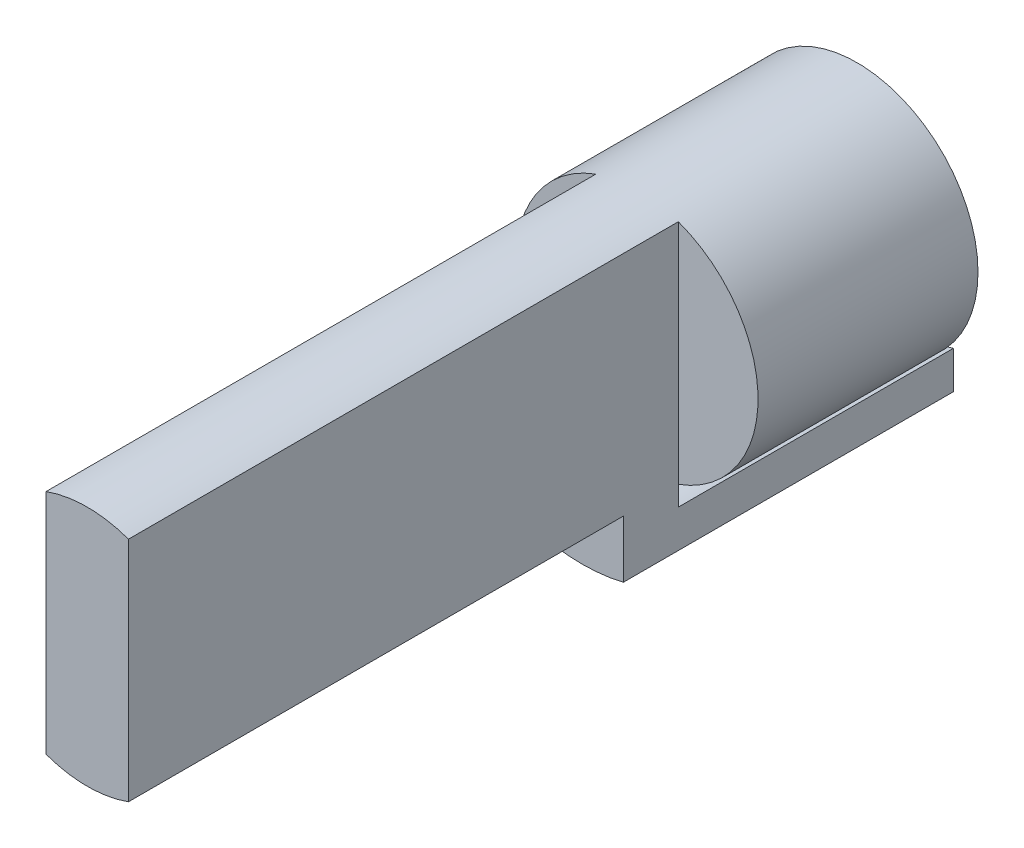
ISO-10303-21;
HEADER;
FILE_DESCRIPTION(('STEP AP214'),'2;1');
FILE_NAME('part.step','',(''),(''),'','','');
FILE_SCHEMA(('AUTOMOTIVE_DESIGN { 1 0 10303 214 1 1 1 1 }'));
ENDSEC;
DATA;
#1=APPLICATION_CONTEXT('core data for automotive mechanical design processes');
#2=APPLICATION_PROTOCOL_DEFINITION('international standard','automotive_design',2000,#1);
#3=PRODUCT_CONTEXT('',#1,'mechanical');
#4=PRODUCT('Part','Part','',(#3));
#5=PRODUCT_RELATED_PRODUCT_CATEGORY('part','',(#4));
#6=PRODUCT_DEFINITION_FORMATION('','',#4);
#7=PRODUCT_DEFINITION_CONTEXT('part definition',#1,'design');
#8=PRODUCT_DEFINITION('design','',#6,#7);
#9=PRODUCT_DEFINITION_SHAPE('','',#8);
#10=(LENGTH_UNIT() NAMED_UNIT(*) SI_UNIT(.MILLI.,.METRE.));
#11=(NAMED_UNIT(*) PLANE_ANGLE_UNIT() SI_UNIT($,.RADIAN.));
#12=(NAMED_UNIT(*) SI_UNIT($,.STERADIAN.) SOLID_ANGLE_UNIT());
#13=UNCERTAINTY_MEASURE_WITH_UNIT(LENGTH_MEASURE(1.E-05),#10,'distance_accuracy_value','');
#14=(GEOMETRIC_REPRESENTATION_CONTEXT(3) GLOBAL_UNCERTAINTY_ASSIGNED_CONTEXT((#13)) GLOBAL_UNIT_ASSIGNED_CONTEXT((#10,
#11,#12)) REPRESENTATION_CONTEXT('',''));
#15=CARTESIAN_POINT('',(0.,0.,0.));
#16=DIRECTION('',(0.,0.,1.));
#17=DIRECTION('',(1.,0.,0.));
#18=AXIS2_PLACEMENT_3D('',#15,#16,#17);
#19=CARTESIAN_POINT('',(3.75,10.3410589399732,70.));
#20=DIRECTION('',(-1.,0.,0.));
#21=DIRECTION('',(0.,-1.,0.));
#22=AXIS2_PLACEMENT_3D('',#19,#20,#21);
#23=PLANE('',#22);
#24=DIRECTION('',(0.,1.,0.));
#25=VECTOR('',#24,1.);
#26=CARTESIAN_POINT('',(3.75,0.,25.));
#27=LINE('',#26,#25);
#28=CARTESIAN_POINT('',(3.75,-15.5543402303023,25.));
#29=VERTEX_POINT('',#28);
#30=CARTESIAN_POINT('',(3.75,-10.3410589399732,25.));
#31=VERTEX_POINT('',#30);
#32=EDGE_CURVE('E66',#29,#31,#27,.T.);
#33=ORIENTED_EDGE('',*,*,#32,.F.);
#34=DIRECTION('',(0.,0.,1.));
#35=VECTOR('',#34,1.);
#36=CARTESIAN_POINT('',(3.75,-15.5543402303023,-5.));
#37=LINE('',#36,#35);
#38=CARTESIAN_POINT('',(3.75,-15.5543402303023,-5.));
#39=VERTEX_POINT('',#38);
#40=EDGE_CURVE('E188',#39,#29,#37,.T.);
#41=ORIENTED_EDGE('',*,*,#40,.F.);
#42=DIRECTION('',(0.,1.,0.));
#43=VECTOR('',#42,1.);
#44=CARTESIAN_POINT('',(3.75,0.,-5.));
#45=LINE('',#44,#43);
#46=CARTESIAN_POINT('',(3.75,-12.1337339677446,-5.));
#47=VERTEX_POINT('',#46);
#48=EDGE_CURVE('E195',#39,#47,#45,.T.);
#49=ORIENTED_EDGE('',*,*,#48,.T.);
#50=DIRECTION('',(0.,0.,1.));
#51=VECTOR('',#50,1.);
#52=CARTESIAN_POINT('',(3.75,-12.1337339677446,-5.));
#53=LINE('',#52,#51);
#54=CARTESIAN_POINT('',(3.75,-12.1337339677446,20.));
#55=VERTEX_POINT('',#54);
#56=EDGE_CURVE('E180',#47,#55,#53,.T.);
#57=ORIENTED_EDGE('',*,*,#56,.T.);
#58=DIRECTION('',(0.,1.,0.));
#59=VECTOR('',#58,1.);
#60=CARTESIAN_POINT('',(3.75,0.,20.));
#61=LINE('',#60,#59);
#62=CARTESIAN_POINT('',(3.75,-10.3410589399732,20.));
#63=VERTEX_POINT('',#62);
#64=EDGE_CURVE('E139',#55,#63,#61,.T.);
#65=ORIENTED_EDGE('',*,*,#64,.T.);
#66=DIRECTION('',(0.,1.,0.));
#67=VECTOR('',#66,1.);
#68=CARTESIAN_POINT('',(3.75,10.3410589399732,20.));
#69=LINE('',#68,#67);
#70=CARTESIAN_POINT('',(3.75,10.3410589399732,20.));
#71=VERTEX_POINT('',#70);
#72=EDGE_CURVE('E164',#63,#71,#69,.T.);
#73=ORIENTED_EDGE('',*,*,#72,.T.);
#74=DIRECTION('',(0.,0.,-1.));
#75=VECTOR('',#74,1.);
#76=CARTESIAN_POINT('',(3.75,10.3410589399732,70.));
#77=LINE('',#76,#75);
#78=CARTESIAN_POINT('',(3.75,10.3410589399732,70.));
#79=VERTEX_POINT('',#78);
#80=EDGE_CURVE('E152',#79,#71,#77,.T.);
#81=ORIENTED_EDGE('',*,*,#80,.F.);
#82=DIRECTION('',(0.,1.,0.));
#83=VECTOR('',#82,1.);
#84=CARTESIAN_POINT('',(3.75,10.3410589399732,70.));
#85=LINE('',#84,#83);
#86=CARTESIAN_POINT('',(3.75,-10.3410589399732,70.));
#87=VERTEX_POINT('',#86);
#88=EDGE_CURVE('E171',#87,#79,#85,.T.);
#89=ORIENTED_EDGE('',*,*,#88,.F.);
#90=DIRECTION('',(0.,0.,-1.));
#91=VECTOR('',#90,1.);
#92=CARTESIAN_POINT('',(3.75,-10.3410589399732,70.));
#93=LINE('',#92,#91);
#94=EDGE_CURVE('E148',#87,#31,#93,.T.);
#95=ORIENTED_EDGE('',*,*,#94,.T.);
#96=EDGE_LOOP('',(#33,#41,#49,#57,#65,#73,#81,#89,#95));
#97=FACE_BOUND('',#96,.T.);
#98=ADVANCED_FACE('F43',(#97),#23,.F.);
#99=CARTESIAN_POINT('',(-3.75,10.3410589399732,70.));
#100=DIRECTION('',(1.,0.,0.));
#101=DIRECTION('',(0.,1.,0.));
#102=AXIS2_PLACEMENT_3D('',#99,#100,#101);
#103=PLANE('',#102);
#104=DIRECTION('',(0.,-1.,0.));
#105=VECTOR('',#104,1.);
#106=CARTESIAN_POINT('',(-3.75,0.,20.));
#107=LINE('',#106,#105);
#108=CARTESIAN_POINT('',(-3.75,-10.3410589399732,20.));
#109=VERTEX_POINT('',#108);
#110=CARTESIAN_POINT('',(-3.75,-15.5543402303023,20.));
#111=VERTEX_POINT('',#110);
#112=EDGE_CURVE('E175',#109,#111,#107,.T.);
#113=ORIENTED_EDGE('',*,*,#112,.T.);
#114=DIRECTION('',(0.,0.,1.));
#115=VECTOR('',#114,1.);
#116=CARTESIAN_POINT('',(-3.75000000000001,-15.5543402303023,-5.));
#117=LINE('',#116,#115);
#118=CARTESIAN_POINT('',(-3.75000000000001,-15.5543402303023,25.));
#119=VERTEX_POINT('',#118);
#120=EDGE_CURVE('E186',#111,#119,#117,.T.);
#121=ORIENTED_EDGE('',*,*,#120,.T.);
#122=DIRECTION('',(0.,-1.,0.));
#123=VECTOR('',#122,1.);
#124=CARTESIAN_POINT('',(-3.75,0.,25.));
#125=LINE('',#124,#123);
#126=CARTESIAN_POINT('',(-3.75,-10.3410589399732,25.));
#127=VERTEX_POINT('',#126);
#128=EDGE_CURVE('E167',#127,#119,#125,.T.);
#129=ORIENTED_EDGE('',*,*,#128,.F.);
#130=DIRECTION('',(0.,0.,-1.));
#131=VECTOR('',#130,1.);
#132=CARTESIAN_POINT('',(-3.75,-10.3410589399732,70.));
#133=LINE('',#132,#131);
#134=CARTESIAN_POINT('',(-3.75,-10.3410589399732,70.));
#135=VERTEX_POINT('',#134);
#136=EDGE_CURVE('E158',#135,#127,#133,.T.);
#137=ORIENTED_EDGE('',*,*,#136,.F.);
#138=DIRECTION('',(0.,-1.,0.));
#139=VECTOR('',#138,1.);
#140=CARTESIAN_POINT('',(-3.75,10.3410589399732,70.));
#141=LINE('',#140,#139);
#142=CARTESIAN_POINT('',(-3.75,10.3410589399732,70.));
#143=VERTEX_POINT('',#142);
#144=EDGE_CURVE('E160',#143,#135,#141,.T.);
#145=ORIENTED_EDGE('',*,*,#144,.F.);
#146=DIRECTION('',(0.,0.,-1.));
#147=VECTOR('',#146,1.);
#148=CARTESIAN_POINT('',(-3.75,10.3410589399732,70.));
#149=LINE('',#148,#147);
#150=CARTESIAN_POINT('',(-3.75,10.3410589399732,20.));
#151=VERTEX_POINT('',#150);
#152=EDGE_CURVE('E155',#143,#151,#149,.T.);
#153=ORIENTED_EDGE('',*,*,#152,.T.);
#154=DIRECTION('',(0.,-1.,0.));
#155=VECTOR('',#154,1.);
#156=CARTESIAN_POINT('',(-3.75,10.3410589399732,20.));
#157=LINE('',#156,#155);
#158=EDGE_CURVE('E161',#151,#109,#157,.T.);
#159=ORIENTED_EDGE('',*,*,#158,.T.);
#160=EDGE_LOOP('',(#113,#121,#129,#137,#145,#153,#159));
#161=FACE_BOUND('',#160,.T.);
#162=ADVANCED_FACE('F221',(#161),#103,.F.);
#163=CARTESIAN_POINT('',(0.,0.,25.));
#164=DIRECTION('',(0.,0.,1.));
#165=DIRECTION('',(1.,0.,0.));
#166=AXIS2_PLACEMENT_3D('',#163,#164,#165);
#167=PLANE('',#166);
#168=ORIENTED_EDGE('',*,*,#128,.T.);
#169=CARTESIAN_POINT('',(0.,0.,25.));
#170=DIRECTION('',(0.,0.,1.));
#171=DIRECTION('',(1.,0.,0.));
#172=AXIS2_PLACEMENT_3D('',#169,#170,#171);
#173=CIRCLE('',#172,16.);
#174=EDGE_CURVE('E134',#119,#29,#173,.T.);
#175=ORIENTED_EDGE('',*,*,#174,.T.);
#176=ORIENTED_EDGE('',*,*,#32,.T.);
#177=CARTESIAN_POINT('',(0.,0.,25.));
#178=DIRECTION('',(0.,0.,1.));
#179=DIRECTION('',(1.,0.,0.));
#180=AXIS2_PLACEMENT_3D('',#177,#178,#179);
#181=CIRCLE('',#180,11.);
#182=EDGE_CURVE('E183',#127,#31,#181,.T.);
#183=ORIENTED_EDGE('',*,*,#182,.F.);
#184=EDGE_LOOP('',(#168,#175,#176,#183));
#185=FACE_BOUND('',#184,.T.);
#186=ADVANCED_FACE('F233',(#185),#167,.T.);
#187=CARTESIAN_POINT('',(0.,0.,20.));
#188=DIRECTION('',(0.,0.,1.));
#189=DIRECTION('',(1.,0.,0.));
#190=AXIS2_PLACEMENT_3D('',#187,#188,#189);
#191=PLANE('',#190);
#192=CARTESIAN_POINT('',(0.,0.,20.));
#193=DIRECTION('',(0.,0.,1.));
#194=DIRECTION('',(1.,0.,0.));
#195=AXIS2_PLACEMENT_3D('',#192,#193,#194);
#196=CIRCLE('',#195,16.);
#197=CARTESIAN_POINT('',(0.,-16.,20.));
#198=VERTEX_POINT('',#197);
#199=EDGE_CURVE('E11',#198,#111,#196,.F.);
#200=ORIENTED_EDGE('',*,*,#199,.T.);
#201=ORIENTED_EDGE('',*,*,#112,.F.);
#202=CARTESIAN_POINT('',(0.,0.,20.));
#203=DIRECTION('',(0.,0.,1.));
#204=DIRECTION('',(1.,0.,0.));
#205=AXIS2_PLACEMENT_3D('',#202,#203,#204);
#206=CIRCLE('',#205,11.);
#207=EDGE_CURVE('E177',#109,#63,#206,.T.);
#208=ORIENTED_EDGE('',*,*,#207,.T.);
#209=ORIENTED_EDGE('',*,*,#64,.F.);
#210=CARTESIAN_POINT('',(0.,0.,20.));
#211=DIRECTION('',(0.,0.,1.));
#212=DIRECTION('',(1.,0.,0.));
#213=AXIS2_PLACEMENT_3D('',#210,#211,#212);
#214=CIRCLE('',#213,12.7);
#215=CARTESIAN_POINT('',(0.,-12.7,20.));
#216=VERTEX_POINT('',#215);
#217=EDGE_CURVE('E131',#216,#55,#214,.T.);
#218=ORIENTED_EDGE('',*,*,#217,.F.);
#219=DIRECTION('',(0.,-1.,0.));
#220=VECTOR('',#219,1.);
#221=CARTESIAN_POINT('',(0.,0.,20.));
#222=LINE('',#221,#220);
#223=EDGE_CURVE('E119',#216,#198,#222,.T.);
#224=ORIENTED_EDGE('',*,*,#223,.T.);
#225=EDGE_LOOP('',(#200,#201,#208,#209,#218,#224));
#226=FACE_BOUND('',#225,.T.);
#227=ADVANCED_FACE('F137',(#226),#191,.F.);
#228=CARTESIAN_POINT('',(0.,0.,20.));
#229=DIRECTION('',(0.,0.,-1.));
#230=DIRECTION('',(-1.,0.,0.));
#231=AXIS2_PLACEMENT_3D('',#228,#229,#230);
#232=CYLINDRICAL_SURFACE('',#231,11.);
#233=CARTESIAN_POINT('',(0.,0.,0.));
#234=DIRECTION('',(0.,0.,1.));
#235=DIRECTION('',(1.,0.,0.));
#236=AXIS2_PLACEMENT_3D('',#233,#234,#235);
#237=CIRCLE('',#236,11.);
#238=CARTESIAN_POINT('',(11.,0.,0.));
#239=VERTEX_POINT('',#238);
#240=EDGE_CURVE('E146',#239,#239,#237,.T.);
#241=ORIENTED_EDGE('',*,*,#240,.T.);
#242=EDGE_LOOP('',(#241));
#243=FACE_BOUND('',#242,.T.);
#244=ORIENTED_EDGE('',*,*,#207,.F.);
#245=CARTESIAN_POINT('',(0.,0.,20.));
#246=DIRECTION('',(0.,0.,1.));
#247=DIRECTION('',(1.,0.,0.));
#248=AXIS2_PLACEMENT_3D('',#245,#246,#247);
#249=CIRCLE('',#248,11.);
#250=EDGE_CURVE('E140',#151,#109,#249,.T.);
#251=ORIENTED_EDGE('',*,*,#250,.F.);
#252=ORIENTED_EDGE('',*,*,#152,.F.);
#253=CARTESIAN_POINT('',(0.,0.,70.));
#254=DIRECTION('',(0.,0.,1.));
#255=DIRECTION('',(1.,0.,0.));
#256=AXIS2_PLACEMENT_3D('',#253,#254,#255);
#257=CIRCLE('',#256,11.);
#258=EDGE_CURVE('E169',#79,#143,#257,.T.);
#259=ORIENTED_EDGE('',*,*,#258,.F.);
#260=ORIENTED_EDGE('',*,*,#80,.T.);
#261=EDGE_CURVE('E143',#63,#71,#249,.T.);
#262=ORIENTED_EDGE('',*,*,#261,.F.);
#263=EDGE_LOOP('',(#244,#251,#252,#259,#260,#262));
#264=FACE_BOUND('',#263,.T.);
#265=ADVANCED_FACE('F215',(#243,#264),#232,.T.);
#266=CARTESIAN_POINT('',(0.,0.,20.));
#267=DIRECTION('',(0.,0.,1.));
#268=DIRECTION('',(1.,0.,0.));
#269=AXIS2_PLACEMENT_3D('',#266,#267,#268);
#270=PLANE('',#269);
#271=ORIENTED_EDGE('',*,*,#158,.F.);
#272=ORIENTED_EDGE('',*,*,#250,.T.);
#273=EDGE_LOOP('',(#271,#272));
#274=FACE_BOUND('',#273,.T.);
#275=ADVANCED_FACE('F226',(#274),#270,.T.);
#276=ORIENTED_EDGE('',*,*,#136,.T.);
#277=ORIENTED_EDGE('',*,*,#182,.T.);
#278=ORIENTED_EDGE('',*,*,#94,.F.);
#279=CARTESIAN_POINT('',(0.,0.,70.));
#280=DIRECTION('',(0.,0.,1.));
#281=DIRECTION('',(1.,0.,0.));
#282=AXIS2_PLACEMENT_3D('',#279,#280,#281);
#283=CIRCLE('',#282,11.);
#284=EDGE_CURVE('E163',#135,#87,#283,.T.);
#285=ORIENTED_EDGE('',*,*,#284,.F.);
#286=EDGE_LOOP('',(#276,#277,#278,#285));
#287=FACE_BOUND('',#286,.T.);
#288=ADVANCED_FACE('F45',(#287),#232,.T.);
#289=ORIENTED_EDGE('',*,*,#72,.F.);
#290=ORIENTED_EDGE('',*,*,#261,.T.);
#291=EDGE_LOOP('',(#289,#290));
#292=FACE_BOUND('',#291,.T.);
#293=ADVANCED_FACE('F212',(#292),#270,.T.);
#294=CARTESIAN_POINT('',(0.,0.,0.));
#295=DIRECTION('',(0.,0.,1.));
#296=DIRECTION('',(1.,0.,0.));
#297=AXIS2_PLACEMENT_3D('',#294,#295,#296);
#298=PLANE('',#297);
#299=ORIENTED_EDGE('',*,*,#240,.F.);
#300=EDGE_LOOP('',(#299));
#301=FACE_BOUND('',#300,.T.);
#302=ADVANCED_FACE('F251',(#301),#298,.F.);
#303=CARTESIAN_POINT('',(0.,0.,70.));
#304=DIRECTION('',(0.,0.,1.));
#305=DIRECTION('',(1.,0.,0.));
#306=AXIS2_PLACEMENT_3D('',#303,#304,#305);
#307=PLANE('',#306);
#308=ORIENTED_EDGE('',*,*,#284,.T.);
#309=ORIENTED_EDGE('',*,*,#88,.T.);
#310=ORIENTED_EDGE('',*,*,#258,.T.);
#311=ORIENTED_EDGE('',*,*,#144,.T.);
#312=EDGE_LOOP('',(#308,#309,#310,#311));
#313=FACE_BOUND('',#312,.T.);
#314=ADVANCED_FACE('F230',(#313),#307,.T.);
#315=CARTESIAN_POINT('',(0.,0.,-5.));
#316=DIRECTION('',(0.,0.,1.));
#317=DIRECTION('',(1.,0.,0.));
#318=AXIS2_PLACEMENT_3D('',#315,#316,#317);
#319=CYLINDRICAL_SURFACE('',#318,12.7);
#320=CARTESIAN_POINT('',(0.,0.,-5.));
#321=DIRECTION('',(0.,0.,1.));
#322=DIRECTION('',(1.,0.,0.));
#323=AXIS2_PLACEMENT_3D('',#320,#321,#322);
#324=CIRCLE('',#323,12.7);
#325=CARTESIAN_POINT('',(0.,-12.7,-5.));
#326=VERTEX_POINT('',#325);
#327=EDGE_CURVE('E133',#326,#47,#324,.T.);
#328=ORIENTED_EDGE('',*,*,#327,.F.);
#329=DIRECTION('',(0.,0.,1.));
#330=VECTOR('',#329,1.);
#331=CARTESIAN_POINT('',(0.,-12.7,-5.));
#332=LINE('',#331,#330);
#333=EDGE_CURVE('E58',#326,#216,#332,.T.);
#334=ORIENTED_EDGE('',*,*,#333,.T.);
#335=ORIENTED_EDGE('',*,*,#217,.T.);
#336=ORIENTED_EDGE('',*,*,#56,.F.);
#337=EDGE_LOOP('',(#328,#334,#335,#336));
#338=FACE_BOUND('',#337,.T.);
#339=ADVANCED_FACE('F129',(#338),#319,.F.);
#340=CARTESIAN_POINT('',(0.,0.,-5.));
#341=DIRECTION('',(0.,0.,1.));
#342=DIRECTION('',(1.,0.,0.));
#343=AXIS2_PLACEMENT_3D('',#340,#341,#342);
#344=CYLINDRICAL_SURFACE('',#343,16.);
#345=ORIENTED_EDGE('',*,*,#199,.F.);
#346=DIRECTION('',(0.,0.,1.));
#347=VECTOR('',#346,1.);
#348=CARTESIAN_POINT('',(0.,-16.,-5.));
#349=LINE('',#348,#347);
#350=CARTESIAN_POINT('',(0.,-16.,-5.));
#351=VERTEX_POINT('',#350);
#352=EDGE_CURVE('E122',#351,#198,#349,.T.);
#353=ORIENTED_EDGE('',*,*,#352,.F.);
#354=CARTESIAN_POINT('',(0.,0.,-5.));
#355=DIRECTION('',(0.,0.,1.));
#356=DIRECTION('',(1.,0.,0.));
#357=AXIS2_PLACEMENT_3D('',#354,#355,#356);
#358=CIRCLE('',#357,16.);
#359=EDGE_CURVE('E193',#351,#39,#358,.T.);
#360=ORIENTED_EDGE('',*,*,#359,.T.);
#361=ORIENTED_EDGE('',*,*,#40,.T.);
#362=ORIENTED_EDGE('',*,*,#174,.F.);
#363=ORIENTED_EDGE('',*,*,#120,.F.);
#364=EDGE_LOOP('',(#345,#353,#360,#361,#362,#363));
#365=FACE_BOUND('',#364,.T.);
#366=ADVANCED_FACE('F202',(#365),#344,.T.);
#367=CARTESIAN_POINT('',(0.,0.,-5.));
#368=DIRECTION('',(0.,0.,1.));
#369=DIRECTION('',(1.,0.,0.));
#370=AXIS2_PLACEMENT_3D('',#367,#368,#369);
#371=PLANE('',#370);
#372=ORIENTED_EDGE('',*,*,#359,.F.);
#373=DIRECTION('',(0.,1.,0.));
#374=VECTOR('',#373,1.);
#375=CARTESIAN_POINT('',(0.,0.,-5.));
#376=LINE('',#375,#374);
#377=EDGE_CURVE('E51',#351,#326,#376,.T.);
#378=ORIENTED_EDGE('',*,*,#377,.T.);
#379=ORIENTED_EDGE('',*,*,#327,.T.);
#380=ORIENTED_EDGE('',*,*,#48,.F.);
#381=EDGE_LOOP('',(#372,#378,#379,#380));
#382=FACE_BOUND('',#381,.T.);
#383=ADVANCED_FACE('F207',(#382),#371,.F.);
#384=CARTESIAN_POINT('',(0.,0.,36.9946126584141));
#385=DIRECTION('',(1.,0.,0.));
#386=DIRECTION('',(0.,0.,-1.));
#387=AXIS2_PLACEMENT_3D('',#384,#385,#386);
#388=PLANE('',#387);
#389=ORIENTED_EDGE('',*,*,#377,.F.);
#390=ORIENTED_EDGE('',*,*,#352,.T.);
#391=ORIENTED_EDGE('',*,*,#223,.F.);
#392=ORIENTED_EDGE('',*,*,#333,.F.);
#393=EDGE_LOOP('',(#389,#390,#391,#392));
#394=FACE_BOUND('',#393,.T.);
#395=ADVANCED_FACE('F120',(#394),#388,.F.);
#396=CLOSED_SHELL('',(#98,#162,#186,#227,#265,#275,#288,#293,#302,#314,#339,#366,#383,#395));
#397=MANIFOLD_SOLID_BREP('B2',#396);
#398=ADVANCED_BREP_SHAPE_REPRESENTATION('',(#18,#397),#14);
#399=SHAPE_DEFINITION_REPRESENTATION(#9,#398);
ENDSEC;
END-ISO-10303-21;
